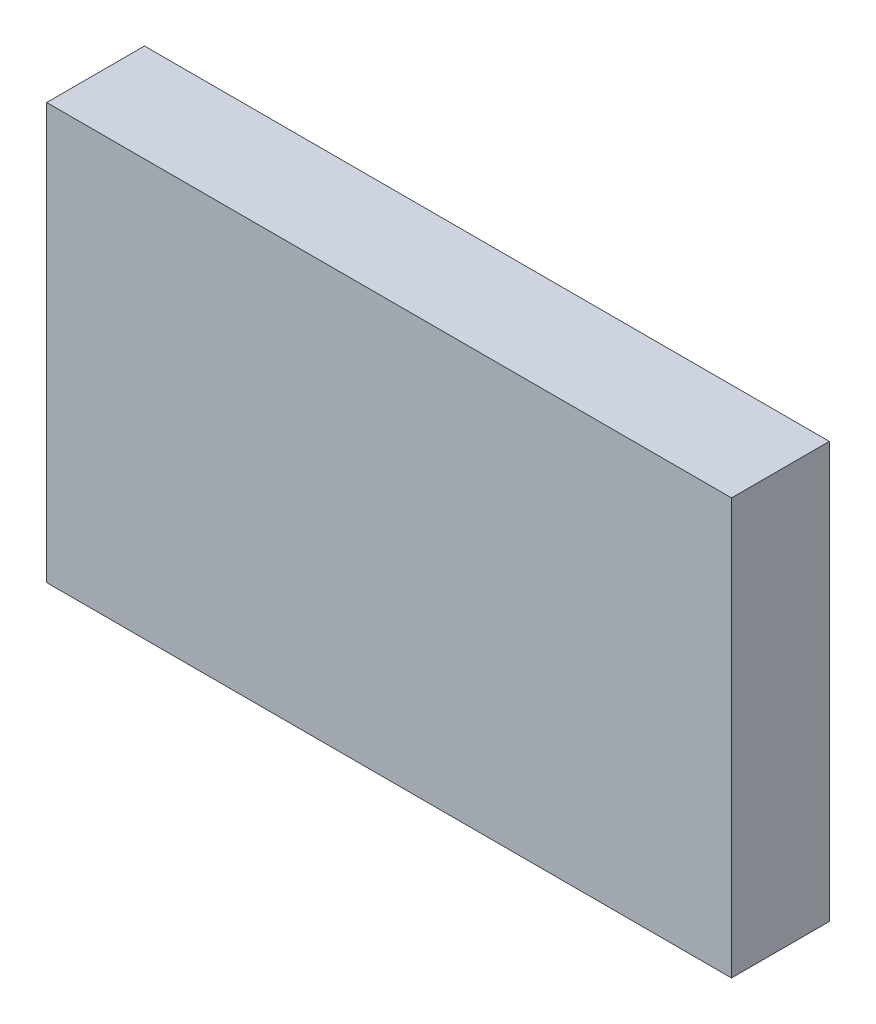
ISO-10303-21;
HEADER;
FILE_DESCRIPTION(('STEP AP214'),'2;1');
FILE_NAME('part.step','',(''),(''),'','','');
FILE_SCHEMA(('AUTOMOTIVE_DESIGN { 1 0 10303 214 1 1 1 1 }'));
ENDSEC;
DATA;
#1=APPLICATION_CONTEXT('core data for automotive mechanical design processes');
#2=APPLICATION_PROTOCOL_DEFINITION('international standard','automotive_design',2000,#1);
#3=PRODUCT_CONTEXT('',#1,'mechanical');
#4=PRODUCT('Part','Part','',(#3));
#5=PRODUCT_RELATED_PRODUCT_CATEGORY('part','',(#4));
#6=PRODUCT_DEFINITION_FORMATION('','',#4);
#7=PRODUCT_DEFINITION_CONTEXT('part definition',#1,'design');
#8=PRODUCT_DEFINITION('design','',#6,#7);
#9=PRODUCT_DEFINITION_SHAPE('','',#8);
#10=(LENGTH_UNIT() NAMED_UNIT(*) SI_UNIT(.MILLI.,.METRE.));
#11=(NAMED_UNIT(*) PLANE_ANGLE_UNIT() SI_UNIT($,.RADIAN.));
#12=(NAMED_UNIT(*) SI_UNIT($,.STERADIAN.) SOLID_ANGLE_UNIT());
#13=UNCERTAINTY_MEASURE_WITH_UNIT(LENGTH_MEASURE(1.E-05),#10,'distance_accuracy_value','');
#14=(GEOMETRIC_REPRESENTATION_CONTEXT(3) GLOBAL_UNCERTAINTY_ASSIGNED_CONTEXT((#13)) GLOBAL_UNIT_ASSIGNED_CONTEXT((#10,
#11,#12)) REPRESENTATION_CONTEXT('',''));
#15=CARTESIAN_POINT('',(0.,0.,0.));
#16=DIRECTION('',(0.,0.,1.));
#17=DIRECTION('',(1.,0.,0.));
#18=AXIS2_PLACEMENT_3D('',#15,#16,#17);
#19=CARTESIAN_POINT('',(0.,0.,20.));
#20=DIRECTION('',(1.,0.,0.));
#21=DIRECTION('',(0.,1.,0.));
#22=AXIS2_PLACEMENT_3D('',#19,#20,#21);
#23=PLANE('',#22);
#24=DIRECTION('',(0.,-1.,0.));
#25=VECTOR('',#24,1.);
#26=CARTESIAN_POINT('',(0.,0.,0.));
#27=LINE('',#26,#25);
#28=CARTESIAN_POINT('',(0.,0.,0.));
#29=VERTEX_POINT('',#28);
#30=CARTESIAN_POINT('',(0.,-85.,0.));
#31=VERTEX_POINT('',#30);
#32=EDGE_CURVE('E100',#29,#31,#27,.T.);
#33=ORIENTED_EDGE('',*,*,#32,.T.);
#34=DIRECTION('',(0.,0.,-1.));
#35=VECTOR('',#34,1.);
#36=CARTESIAN_POINT('',(0.,-85.,20.));
#37=LINE('',#36,#35);
#38=CARTESIAN_POINT('',(0.,-85.,20.));
#39=VERTEX_POINT('',#38);
#40=EDGE_CURVE('E11',#39,#31,#37,.T.);
#41=ORIENTED_EDGE('',*,*,#40,.F.);
#42=DIRECTION('',(0.,-1.,0.));
#43=VECTOR('',#42,1.);
#44=CARTESIAN_POINT('',(0.,0.,20.));
#45=LINE('',#44,#43);
#46=CARTESIAN_POINT('',(0.,0.,20.));
#47=VERTEX_POINT('',#46);
#48=EDGE_CURVE('E88',#47,#39,#45,.T.);
#49=ORIENTED_EDGE('',*,*,#48,.F.);
#50=DIRECTION('',(0.,0.,-1.));
#51=VECTOR('',#50,1.);
#52=CARTESIAN_POINT('',(0.,0.,20.));
#53=LINE('',#52,#51);
#54=EDGE_CURVE('E96',#47,#29,#53,.T.);
#55=ORIENTED_EDGE('',*,*,#54,.T.);
#56=EDGE_LOOP('',(#33,#41,#49,#55));
#57=FACE_BOUND('',#56,.T.);
#58=ADVANCED_FACE('F37',(#57),#23,.F.);
#59=CARTESIAN_POINT('',(0.,-85.,20.));
#60=DIRECTION('',(0.,1.,0.));
#61=DIRECTION('',(0.,0.,1.));
#62=AXIS2_PLACEMENT_3D('',#59,#60,#61);
#63=PLANE('',#62);
#64=DIRECTION('',(1.,0.,0.));
#65=VECTOR('',#64,1.);
#66=CARTESIAN_POINT('',(0.,-85.,0.));
#67=LINE('',#66,#65);
#68=CARTESIAN_POINT('',(140.,-85.,0.));
#69=VERTEX_POINT('',#68);
#70=EDGE_CURVE('E92',#31,#69,#67,.T.);
#71=ORIENTED_EDGE('',*,*,#70,.T.);
#72=DIRECTION('',(0.,0.,-1.));
#73=VECTOR('',#72,1.);
#74=CARTESIAN_POINT('',(140.,-85.,20.));
#75=LINE('',#74,#73);
#76=CARTESIAN_POINT('',(140.,-85.,20.));
#77=VERTEX_POINT('',#76);
#78=EDGE_CURVE('E45',#77,#69,#75,.T.);
#79=ORIENTED_EDGE('',*,*,#78,.F.);
#80=DIRECTION('',(1.,0.,0.));
#81=VECTOR('',#80,1.);
#82=CARTESIAN_POINT('',(0.,-85.,20.));
#83=LINE('',#82,#81);
#84=EDGE_CURVE('E83',#39,#77,#83,.T.);
#85=ORIENTED_EDGE('',*,*,#84,.F.);
#86=ORIENTED_EDGE('',*,*,#40,.T.);
#87=EDGE_LOOP('',(#71,#79,#85,#86));
#88=FACE_BOUND('',#87,.T.);
#89=ADVANCED_FACE('F91',(#88),#63,.F.);
#90=CARTESIAN_POINT('',(140.,0.,20.));
#91=DIRECTION('',(-1.,0.,0.));
#92=DIRECTION('',(0.,0.,1.));
#93=AXIS2_PLACEMENT_3D('',#90,#91,#92);
#94=PLANE('',#93);
#95=DIRECTION('',(0.,1.,0.));
#96=VECTOR('',#95,1.);
#97=CARTESIAN_POINT('',(140.,0.,0.));
#98=LINE('',#97,#96);
#99=CARTESIAN_POINT('',(140.,0.,0.));
#100=VERTEX_POINT('',#99);
#101=EDGE_CURVE('E70',#69,#100,#98,.T.);
#102=ORIENTED_EDGE('',*,*,#101,.T.);
#103=DIRECTION('',(0.,0.,-1.));
#104=VECTOR('',#103,1.);
#105=CARTESIAN_POINT('',(140.,0.,20.));
#106=LINE('',#105,#104);
#107=CARTESIAN_POINT('',(140.,0.,20.));
#108=VERTEX_POINT('',#107);
#109=EDGE_CURVE('E93',#108,#100,#106,.T.);
#110=ORIENTED_EDGE('',*,*,#109,.F.);
#111=DIRECTION('',(0.,1.,0.));
#112=VECTOR('',#111,1.);
#113=CARTESIAN_POINT('',(140.,0.,20.));
#114=LINE('',#113,#112);
#115=EDGE_CURVE('E86',#77,#108,#114,.T.);
#116=ORIENTED_EDGE('',*,*,#115,.F.);
#117=ORIENTED_EDGE('',*,*,#78,.T.);
#118=EDGE_LOOP('',(#102,#110,#116,#117));
#119=FACE_BOUND('',#118,.T.);
#120=ADVANCED_FACE('F94',(#119),#94,.F.);
#121=CARTESIAN_POINT('',(0.,0.,20.));
#122=DIRECTION('',(0.,-1.,0.));
#123=DIRECTION('',(0.,0.,-1.));
#124=AXIS2_PLACEMENT_3D('',#121,#122,#123);
#125=PLANE('',#124);
#126=DIRECTION('',(-1.,0.,0.));
#127=VECTOR('',#126,1.);
#128=CARTESIAN_POINT('',(0.,0.,0.));
#129=LINE('',#128,#127);
#130=EDGE_CURVE('E76',#100,#29,#129,.T.);
#131=ORIENTED_EDGE('',*,*,#130,.T.);
#132=ORIENTED_EDGE('',*,*,#54,.F.);
#133=DIRECTION('',(-1.,0.,0.));
#134=VECTOR('',#133,1.);
#135=CARTESIAN_POINT('',(0.,0.,20.));
#136=LINE('',#135,#134);
#137=EDGE_CURVE('E53',#108,#47,#136,.T.);
#138=ORIENTED_EDGE('',*,*,#137,.F.);
#139=ORIENTED_EDGE('',*,*,#109,.T.);
#140=EDGE_LOOP('',(#131,#132,#138,#139));
#141=FACE_BOUND('',#140,.T.);
#142=ADVANCED_FACE('F107',(#141),#125,.F.);
#143=CARTESIAN_POINT('',(0.,0.,20.));
#144=DIRECTION('',(0.,0.,1.));
#145=DIRECTION('',(1.,0.,0.));
#146=AXIS2_PLACEMENT_3D('',#143,#144,#145);
#147=PLANE('',#146);
#148=ORIENTED_EDGE('',*,*,#48,.T.);
#149=ORIENTED_EDGE('',*,*,#84,.T.);
#150=ORIENTED_EDGE('',*,*,#115,.T.);
#151=ORIENTED_EDGE('',*,*,#137,.T.);
#152=EDGE_LOOP('',(#148,#149,#150,#151));
#153=FACE_BOUND('',#152,.T.);
#154=ADVANCED_FACE('F84',(#153),#147,.T.);
#155=CARTESIAN_POINT('',(0.,0.,0.));
#156=DIRECTION('',(0.,0.,1.));
#157=DIRECTION('',(1.,0.,0.));
#158=AXIS2_PLACEMENT_3D('',#155,#156,#157);
#159=PLANE('',#158);
#160=ORIENTED_EDGE('',*,*,#32,.F.);
#161=ORIENTED_EDGE('',*,*,#130,.F.);
#162=ORIENTED_EDGE('',*,*,#101,.F.);
#163=ORIENTED_EDGE('',*,*,#70,.F.);
#164=EDGE_LOOP('',(#160,#161,#162,#163));
#165=FACE_BOUND('',#164,.T.);
#166=ADVANCED_FACE('F110',(#165),#159,.F.);
#167=CLOSED_SHELL('',(#58,#89,#120,#142,#154,#166));
#168=MANIFOLD_SOLID_BREP('B2',#167);
#169=ADVANCED_BREP_SHAPE_REPRESENTATION('',(#18,#168),#14);
#170=SHAPE_DEFINITION_REPRESENTATION(#9,#169);
ENDSEC;
END-ISO-10303-21;
